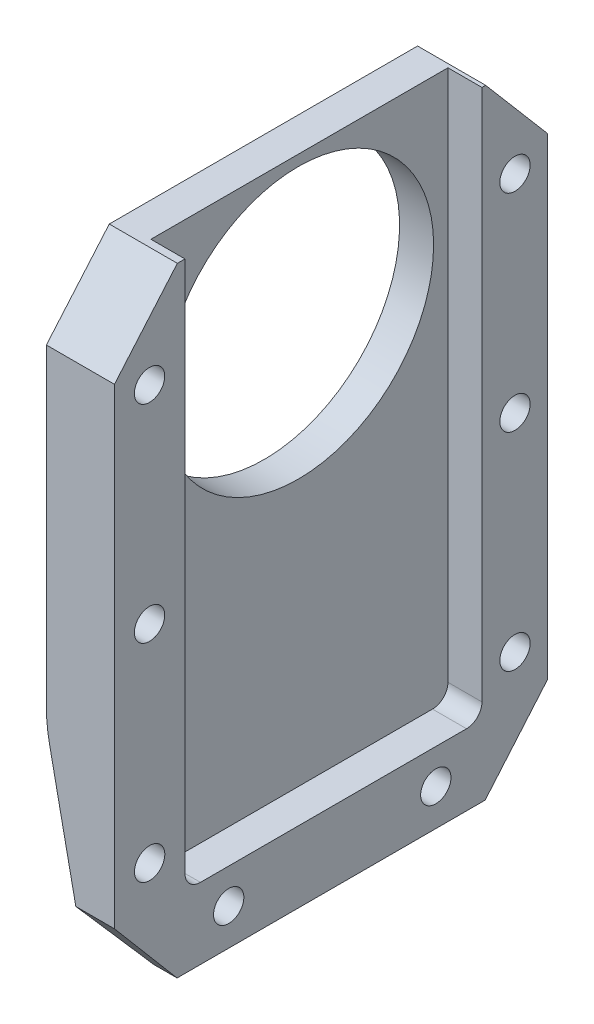
ISO-10303-21;
HEADER;
FILE_DESCRIPTION(('STEP AP214'),'2;1');
FILE_NAME('part.step','',(''),(''),'','','');
FILE_SCHEMA(('AUTOMOTIVE_DESIGN { 1 0 10303 214 1 1 1 1 }'));
ENDSEC;
DATA;
#1=APPLICATION_CONTEXT('core data for automotive mechanical design processes');
#2=APPLICATION_PROTOCOL_DEFINITION('international standard','automotive_design',2000,#1);
#3=PRODUCT_CONTEXT('',#1,'mechanical');
#4=PRODUCT('Part','Part','',(#3));
#5=PRODUCT_RELATED_PRODUCT_CATEGORY('part','',(#4));
#6=PRODUCT_DEFINITION_FORMATION('','',#4);
#7=PRODUCT_DEFINITION_CONTEXT('part definition',#1,'design');
#8=PRODUCT_DEFINITION('design','',#6,#7);
#9=PRODUCT_DEFINITION_SHAPE('','',#8);
#10=(LENGTH_UNIT() NAMED_UNIT(*) SI_UNIT(.MILLI.,.METRE.));
#11=(NAMED_UNIT(*) PLANE_ANGLE_UNIT() SI_UNIT($,.RADIAN.));
#12=(NAMED_UNIT(*) SI_UNIT($,.STERADIAN.) SOLID_ANGLE_UNIT());
#13=UNCERTAINTY_MEASURE_WITH_UNIT(LENGTH_MEASURE(1.E-05),#10,'distance_accuracy_value','');
#14=(GEOMETRIC_REPRESENTATION_CONTEXT(3) GLOBAL_UNCERTAINTY_ASSIGNED_CONTEXT((#13)) GLOBAL_UNIT_ASSIGNED_CONTEXT((#10,
#11,#12)) REPRESENTATION_CONTEXT('',''));
#15=CARTESIAN_POINT('',(0.,0.,0.));
#16=DIRECTION('',(0.,0.,1.));
#17=DIRECTION('',(1.,0.,0.));
#18=AXIS2_PLACEMENT_3D('',#15,#16,#17);
#19=CARTESIAN_POINT('',(-1.91664376205864,0.,35.56));
#20=DIRECTION('',(0.,1.,0.));
#21=DIRECTION('',(0.,0.,1.));
#22=AXIS2_PLACEMENT_3D('',#19,#20,#21);
#23=PLANE('',#22);
#24=DIRECTION('',(0.,0.,-1.));
#25=VECTOR('',#24,1.);
#26=CARTESIAN_POINT('',(-1.91664376205864,0.,35.56));
#27=LINE('',#26,#25);
#28=CARTESIAN_POINT('',(-1.91664376205864,0.,30.4170918583045));
#29=VERTEX_POINT('',#28);
#30=CARTESIAN_POINT('',(-1.91664376205864,0.,5.12869281639009));
#31=VERTEX_POINT('',#30);
#32=EDGE_CURVE('E183',#29,#31,#27,.T.);
#33=ORIENTED_EDGE('',*,*,#32,.T.);
#34=DIRECTION('',(1.,0.,0.));
#35=VECTOR('',#34,1.);
#36=CARTESIAN_POINT('',(-5.588,0.,5.12869281639009));
#37=LINE('',#36,#35);
#38=CARTESIAN_POINT('',(0.,0.,5.12869281639009));
#39=VERTEX_POINT('',#38);
#40=EDGE_CURVE('E242',#31,#39,#37,.T.);
#41=ORIENTED_EDGE('',*,*,#40,.T.);
#42=DIRECTION('',(0.,0.,-1.));
#43=VECTOR('',#42,1.);
#44=CARTESIAN_POINT('',(0.,0.,35.56));
#45=LINE('',#44,#43);
#46=CARTESIAN_POINT('',(0.,0.,30.4170918583045));
#47=VERTEX_POINT('',#46);
#48=EDGE_CURVE('E191',#47,#39,#45,.T.);
#49=ORIENTED_EDGE('',*,*,#48,.F.);
#50=DIRECTION('',(1.,0.,0.));
#51=VECTOR('',#50,1.);
#52=CARTESIAN_POINT('',(-5.588,0.,30.4170918583045));
#53=LINE('',#52,#51);
#54=EDGE_CURVE('E223',#29,#47,#53,.T.);
#55=ORIENTED_EDGE('',*,*,#54,.F.);
#56=EDGE_LOOP('',(#33,#41,#49,#55));
#57=FACE_BOUND('',#56,.T.);
#58=ADVANCED_FACE('F37',(#57),#23,.F.);
#59=CARTESIAN_POINT('',(0.,0.,35.56));
#60=DIRECTION('',(-1.,0.,0.));
#61=DIRECTION('',(0.,0.,1.));
#62=AXIS2_PLACEMENT_3D('',#59,#60,#61);
#63=PLANE('',#62);
#64=CARTESIAN_POINT('',(0.,43.3095233691544,2.67853591924794));
#65=DIRECTION('',(-1.,0.,0.));
#66=DIRECTION('',(0.,0.,1.));
#67=AXIS2_PLACEMENT_3D('',#64,#65,#66);
#68=CIRCLE('',#67,1.24459999999998);
#69=CARTESIAN_POINT('',(0.,43.3095233691544,3.92313591924793));
#70=VERTEX_POINT('',#69);
#71=EDGE_CURVE('E689',#70,#70,#68,.T.);
#72=ORIENTED_EDGE('',*,*,#71,.T.);
#73=EDGE_LOOP('',(#72));
#74=FACE_BOUND('',#73,.T.);
#75=CARTESIAN_POINT('',(0.,26.3095233691544,2.67853591924794));
#76=DIRECTION('',(-1.,0.,0.));
#77=DIRECTION('',(0.,0.,1.));
#78=AXIS2_PLACEMENT_3D('',#75,#76,#77);
#79=CIRCLE('',#78,1.24459999999999);
#80=CARTESIAN_POINT('',(0.,26.3095233691544,3.92313591924793));
#81=VERTEX_POINT('',#80);
#82=EDGE_CURVE('E700',#81,#81,#79,.T.);
#83=ORIENTED_EDGE('',*,*,#82,.T.);
#84=EDGE_LOOP('',(#83));
#85=FACE_BOUND('',#84,.T.);
#86=CARTESIAN_POINT('',(0.,9.30952336915439,2.67853591924794));
#87=DIRECTION('',(-1.,0.,0.));
#88=DIRECTION('',(0.,0.,1.));
#89=AXIS2_PLACEMENT_3D('',#86,#87,#88);
#90=CIRCLE('',#89,1.24459999999999);
#91=CARTESIAN_POINT('',(0.,9.30952336915439,3.92313591924793));
#92=VERTEX_POINT('',#91);
#93=EDGE_CURVE('E703',#92,#92,#90,.T.);
#94=ORIENTED_EDGE('',*,*,#93,.T.);
#95=EDGE_LOOP('',(#94));
#96=FACE_BOUND('',#95,.T.);
#97=CARTESIAN_POINT('',(0.,3.00952336915439,9.17853591924794));
#98=DIRECTION('',(-1.,0.,0.));
#99=DIRECTION('',(0.,0.,1.));
#100=AXIS2_PLACEMENT_3D('',#97,#98,#99);
#101=CIRCLE('',#100,1.24459999999999);
#102=CARTESIAN_POINT('',(0.,3.00952336915439,10.4231359192479));
#103=VERTEX_POINT('',#102);
#104=EDGE_CURVE('E709',#103,#103,#101,.T.);
#105=ORIENTED_EDGE('',*,*,#104,.T.);
#106=EDGE_LOOP('',(#105));
#107=FACE_BOUND('',#106,.T.);
#108=CARTESIAN_POINT('',(0.,2.9991799424324,26.181895158461));
#109=DIRECTION('',(-1.,0.,0.));
#110=DIRECTION('',(0.,0.,1.));
#111=AXIS2_PLACEMENT_3D('',#108,#109,#110);
#112=CIRCLE('',#111,1.24459999999999);
#113=CARTESIAN_POINT('',(0.,2.9991799424324,27.4264951584609));
#114=VERTEX_POINT('',#113);
#115=EDGE_CURVE('E715',#114,#114,#112,.T.);
#116=ORIENTED_EDGE('',*,*,#115,.T.);
#117=EDGE_LOOP('',(#116));
#118=FACE_BOUND('',#117,.T.);
#119=CARTESIAN_POINT('',(0.,9.2991799424324,32.6729429087411));
#120=DIRECTION('',(-1.,0.,0.));
#121=DIRECTION('',(0.,0.,1.));
#122=AXIS2_PLACEMENT_3D('',#119,#120,#121);
#123=CIRCLE('',#122,1.24459999999999);
#124=CARTESIAN_POINT('',(0.,9.2991799424324,33.9175429087411));
#125=VERTEX_POINT('',#124);
#126=EDGE_CURVE('E721',#125,#125,#123,.T.);
#127=ORIENTED_EDGE('',*,*,#126,.T.);
#128=EDGE_LOOP('',(#127));
#129=FACE_BOUND('',#128,.T.);
#130=CARTESIAN_POINT('',(0.,26.3095233691544,32.6785359192479));
#131=DIRECTION('',(-1.,0.,0.));
#132=DIRECTION('',(0.,0.,1.));
#133=AXIS2_PLACEMENT_3D('',#130,#131,#132);
#134=CIRCLE('',#133,1.24459999999999);
#135=CARTESIAN_POINT('',(0.,26.3095233691544,33.9231359192479));
#136=VERTEX_POINT('',#135);
#137=EDGE_CURVE('E730',#136,#136,#134,.T.);
#138=ORIENTED_EDGE('',*,*,#137,.T.);
#139=EDGE_LOOP('',(#138));
#140=FACE_BOUND('',#139,.T.);
#141=CARTESIAN_POINT('',(0.,43.2991799424324,32.6785359192479));
#142=DIRECTION('',(-1.,0.,0.));
#143=DIRECTION('',(0.,0.,1.));
#144=AXIS2_PLACEMENT_3D('',#141,#142,#143);
#145=CIRCLE('',#144,1.24459999999998);
#146=CARTESIAN_POINT('',(0.,43.2991799424324,33.9231359192479));
#147=VERTEX_POINT('',#146);
#148=EDGE_CURVE('E229',#147,#147,#145,.T.);
#149=ORIENTED_EDGE('',*,*,#148,.T.);
#150=EDGE_LOOP('',(#149));
#151=FACE_BOUND('',#150,.T.);
#152=DIRECTION('',(0.,1.,0.));
#153=VECTOR('',#152,1.);
#154=CARTESIAN_POINT('',(0.,0.,0.));
#155=LINE('',#154,#153);
#156=CARTESIAN_POINT('',(0.,6.02953117205409,0.));
#157=VERTEX_POINT('',#156);
#158=CARTESIAN_POINT('',(0.,44.8248953626975,0.));
#159=VERTEX_POINT('',#158);
#160=EDGE_CURVE('E174',#157,#159,#155,.T.);
#161=ORIENTED_EDGE('',*,*,#160,.T.);
#162=DIRECTION('',(0.,-0.761517392748183,-0.648144475053216));
#163=VECTOR('',#162,1.);
#164=CARTESIAN_POINT('',(0.,44.8248953626975,0.));
#165=LINE('',#164,#163);
#166=CARTESIAN_POINT('',(0.,50.8,5.08554511743511));
#167=VERTEX_POINT('',#166);
#168=EDGE_CURVE('E61',#167,#159,#165,.T.);
#169=ORIENTED_EDGE('',*,*,#168,.F.);
#170=DIRECTION('',(0.,0.,-1.));
#171=VECTOR('',#170,1.);
#172=CARTESIAN_POINT('',(0.,50.8,35.56));
#173=LINE('',#172,#171);
#174=CARTESIAN_POINT('',(0.,50.8,5.38804272725211));
#175=VERTEX_POINT('',#174);
#176=EDGE_CURVE('E188',#175,#167,#173,.T.);
#177=ORIENTED_EDGE('',*,*,#176,.F.);
#178=DIRECTION('',(0.,1.,0.));
#179=VECTOR('',#178,1.);
#180=CARTESIAN_POINT('',(0.,50.8,5.38804272725211));
#181=LINE('',#180,#179);
#182=CARTESIAN_POINT('',(0.,7.11199999999999,5.3880427272521));
#183=VERTEX_POINT('',#182);
#184=EDGE_CURVE('E267',#183,#175,#181,.T.);
#185=ORIENTED_EDGE('',*,*,#184,.F.);
#186=CARTESIAN_POINT('',(0.,7.11199999999999,6.6580427272521));
#187=DIRECTION('',(-1.,0.,0.));
#188=DIRECTION('',(0.,0.,1.));
#189=AXIS2_PLACEMENT_3D('',#186,#187,#188);
#190=CIRCLE('',#189,1.27);
#191=CARTESIAN_POINT('',(0.,5.84199999999999,6.6580427272521));
#192=VERTEX_POINT('',#191);
#193=EDGE_CURVE('E218',#183,#192,#190,.T.);
#194=ORIENTED_EDGE('',*,*,#193,.T.);
#195=DIRECTION('',(0.,0.,-1.));
#196=VECTOR('',#195,1.);
#197=CARTESIAN_POINT('',(0.,5.84199999999999,29.7720427272521));
#198=LINE('',#197,#196);
#199=CARTESIAN_POINT('',(0.,5.84199999999999,28.5020427272521));
#200=VERTEX_POINT('',#199);
#201=EDGE_CURVE('E278',#200,#192,#198,.T.);
#202=ORIENTED_EDGE('',*,*,#201,.F.);
#203=CARTESIAN_POINT('',(0.,7.11199999999999,28.5020427272521));
#204=DIRECTION('',(-1.,0.,0.));
#205=DIRECTION('',(0.,0.,1.));
#206=AXIS2_PLACEMENT_3D('',#203,#204,#205);
#207=CIRCLE('',#206,1.27);
#208=CARTESIAN_POINT('',(0.,7.11199999999999,29.7720427272521));
#209=VERTEX_POINT('',#208);
#210=EDGE_CURVE('E216',#200,#209,#207,.T.);
#211=ORIENTED_EDGE('',*,*,#210,.T.);
#212=DIRECTION('',(0.,-1.,0.));
#213=VECTOR('',#212,1.);
#214=CARTESIAN_POINT('',(0.,50.8,29.7720427272521));
#215=LINE('',#214,#213);
#216=CARTESIAN_POINT('',(0.,50.8,29.7720427272521));
#217=VERTEX_POINT('',#216);
#218=EDGE_CURVE('E260',#217,#209,#215,.T.);
#219=ORIENTED_EDGE('',*,*,#218,.F.);
#220=CARTESIAN_POINT('',(0.,50.8,30.3975808510955));
#221=VERTEX_POINT('',#220);
#222=EDGE_CURVE('E189',#221,#217,#173,.T.);
#223=ORIENTED_EDGE('',*,*,#222,.F.);
#224=DIRECTION('',(0.,0.759083371781677,-0.650993421383473));
#225=VECTOR('',#224,1.);
#226=CARTESIAN_POINT('',(0.,44.780420684171,35.56));
#227=LINE('',#226,#225);
#228=CARTESIAN_POINT('',(0.,44.780420684171,35.56));
#229=VERTEX_POINT('',#228);
#230=EDGE_CURVE('E252',#229,#221,#227,.T.);
#231=ORIENTED_EDGE('',*,*,#230,.F.);
#232=DIRECTION('',(0.,1.,0.));
#233=VECTOR('',#232,1.);
#234=CARTESIAN_POINT('',(0.,0.,35.56));
#235=LINE('',#234,#233);
#236=CARTESIAN_POINT('',(0.,6.07121687996455,35.56));
#237=VERTEX_POINT('',#236);
#238=EDGE_CURVE('E177',#237,#229,#235,.T.);
#239=ORIENTED_EDGE('',*,*,#238,.F.);
#240=DIRECTION('',(0.,0.763031396083279,0.646361422573472));
#241=VECTOR('',#240,1.);
#242=CARTESIAN_POINT('',(0.,0.,30.4170918583045));
#243=LINE('',#242,#241);
#244=EDGE_CURVE('E53',#47,#237,#243,.T.);
#245=ORIENTED_EDGE('',*,*,#244,.F.);
#246=ORIENTED_EDGE('',*,*,#48,.T.);
#247=DIRECTION('',(0.,-0.761715388262673,0.647911774305611));
#248=VECTOR('',#247,1.);
#249=CARTESIAN_POINT('',(0.,6.02953117205409,0.));
#250=LINE('',#249,#248);
#251=EDGE_CURVE('E239',#157,#39,#250,.T.);
#252=ORIENTED_EDGE('',*,*,#251,.F.);
#253=EDGE_LOOP('',(#161,#169,#177,#185,#194,#202,#211,#219,#223,#231,#239,#245,#246,#252));
#254=FACE_BOUND('',#253,.T.);
#255=ADVANCED_FACE('F307',(#74,#85,#96,#107,#118,#129,#140,#151,#254),#63,.F.);
#256=CARTESIAN_POINT('',(0.,50.8,35.56));
#257=DIRECTION('',(0.,-1.,0.));
#258=DIRECTION('',(0.,0.,-1.));
#259=AXIS2_PLACEMENT_3D('',#256,#257,#258);
#260=PLANE('',#259);
#261=ORIENTED_EDGE('',*,*,#176,.T.);
#262=DIRECTION('',(1.,0.,0.));
#263=VECTOR('',#262,1.);
#264=CARTESIAN_POINT('',(-5.588,50.8,5.08554511743511));
#265=LINE('',#264,#263);
#266=CARTESIAN_POINT('',(-5.588,50.8,5.08554511743511));
#267=VERTEX_POINT('',#266);
#268=EDGE_CURVE('E157',#267,#167,#265,.T.);
#269=ORIENTED_EDGE('',*,*,#268,.F.);
#270=DIRECTION('',(0.,0.,-1.));
#271=VECTOR('',#270,1.);
#272=CARTESIAN_POINT('',(-5.588,50.8,35.56));
#273=LINE('',#272,#271);
#274=CARTESIAN_POINT('',(-5.588,50.8,30.3975808510955));
#275=VERTEX_POINT('',#274);
#276=EDGE_CURVE('E167',#275,#267,#273,.T.);
#277=ORIENTED_EDGE('',*,*,#276,.F.);
#278=DIRECTION('',(1.,0.,0.));
#279=VECTOR('',#278,1.);
#280=CARTESIAN_POINT('',(-5.588,50.8,30.3975808510955));
#281=LINE('',#280,#279);
#282=EDGE_CURVE('E257',#275,#221,#281,.T.);
#283=ORIENTED_EDGE('',*,*,#282,.T.);
#284=ORIENTED_EDGE('',*,*,#222,.T.);
#285=DIRECTION('',(1.,0.,0.));
#286=VECTOR('',#285,1.);
#287=CARTESIAN_POINT('',(-2.794,50.8,29.7720427272521));
#288=LINE('',#287,#286);
#289=CARTESIAN_POINT('',(-2.794,50.8,29.7720427272521));
#290=VERTEX_POINT('',#289);
#291=EDGE_CURVE('E179',#290,#217,#288,.T.);
#292=ORIENTED_EDGE('',*,*,#291,.F.);
#293=DIRECTION('',(0.,0.,1.));
#294=VECTOR('',#293,1.);
#295=CARTESIAN_POINT('',(-2.794,50.8,29.7720427272521));
#296=LINE('',#295,#294);
#297=CARTESIAN_POINT('',(-2.794,50.8,5.3880427272521));
#298=VERTEX_POINT('',#297);
#299=EDGE_CURVE('E272',#298,#290,#296,.T.);
#300=ORIENTED_EDGE('',*,*,#299,.F.);
#301=DIRECTION('',(1.,0.,0.));
#302=VECTOR('',#301,1.);
#303=CARTESIAN_POINT('',(-2.794,50.8,5.38804272725211));
#304=LINE('',#303,#302);
#305=EDGE_CURVE('E275',#298,#175,#304,.T.);
#306=ORIENTED_EDGE('',*,*,#305,.T.);
#307=EDGE_LOOP('',(#261,#269,#277,#283,#284,#292,#300,#306));
#308=FACE_BOUND('',#307,.T.);
#309=ADVANCED_FACE('F312',(#308),#260,.F.);
#310=CARTESIAN_POINT('',(-5.588,50.8,35.56));
#311=DIRECTION('',(1.,0.,0.));
#312=DIRECTION('',(0.,0.,-1.));
#313=AXIS2_PLACEMENT_3D('',#310,#311,#312);
#314=PLANE('',#313);
#315=CARTESIAN_POINT('',(-5.588,43.3095233691544,2.67853591924794));
#316=DIRECTION('',(-1.,0.,0.));
#317=DIRECTION('',(0.,0.,1.));
#318=AXIS2_PLACEMENT_3D('',#315,#316,#317);
#319=CIRCLE('',#318,1.8796);
#320=CARTESIAN_POINT('',(-5.588,43.3095233691544,4.55813591924795));
#321=VERTEX_POINT('',#320);
#322=EDGE_CURVE('E687',#321,#321,#319,.T.);
#323=ORIENTED_EDGE('',*,*,#322,.F.);
#324=EDGE_LOOP('',(#323));
#325=FACE_BOUND('',#324,.T.);
#326=CARTESIAN_POINT('',(-5.588,26.3095233691544,2.67853591924794));
#327=DIRECTION('',(-1.,0.,0.));
#328=DIRECTION('',(0.,0.,1.));
#329=AXIS2_PLACEMENT_3D('',#326,#327,#328);
#330=CIRCLE('',#329,1.8796);
#331=CARTESIAN_POINT('',(-5.588,26.3095233691544,4.55813591924794));
#332=VERTEX_POINT('',#331);
#333=EDGE_CURVE('E694',#332,#332,#330,.T.);
#334=ORIENTED_EDGE('',*,*,#333,.F.);
#335=EDGE_LOOP('',(#334));
#336=FACE_BOUND('',#335,.T.);
#337=CARTESIAN_POINT('',(-5.588,26.3095233691544,32.6785359192479));
#338=DIRECTION('',(-1.,0.,0.));
#339=DIRECTION('',(0.,0.,1.));
#340=AXIS2_PLACEMENT_3D('',#337,#338,#339);
#341=CIRCLE('',#340,1.8796);
#342=CARTESIAN_POINT('',(-5.588,26.3095233691544,34.5581359192479));
#343=VERTEX_POINT('',#342);
#344=EDGE_CURVE('E724',#343,#343,#341,.T.);
#345=ORIENTED_EDGE('',*,*,#344,.F.);
#346=EDGE_LOOP('',(#345));
#347=FACE_BOUND('',#346,.T.);
#348=CARTESIAN_POINT('',(-5.588,43.2991799424324,32.6785359192479));
#349=DIRECTION('',(-1.,0.,0.));
#350=DIRECTION('',(0.,0.,1.));
#351=AXIS2_PLACEMENT_3D('',#348,#349,#350);
#352=CIRCLE('',#351,1.8796);
#353=CARTESIAN_POINT('',(-5.588,43.2991799424324,34.558135919248));
#354=VERTEX_POINT('',#353);
#355=EDGE_CURVE('E733',#354,#354,#352,.T.);
#356=ORIENTED_EDGE('',*,*,#355,.F.);
#357=EDGE_LOOP('',(#356));
#358=FACE_BOUND('',#357,.T.);
#359=CARTESIAN_POINT('',(-5.588,38.8095233691544,17.6785359192479));
#360=DIRECTION('',(-1.,0.,0.));
#361=DIRECTION('',(0.,0.,1.));
#362=AXIS2_PLACEMENT_3D('',#359,#360,#361);
#363=CIRCLE('',#362,11.1125);
#364=CARTESIAN_POINT('',(-5.588,38.8095233691544,28.7910359192479));
#365=VERTEX_POINT('',#364);
#366=EDGE_CURVE('E224',#365,#365,#363,.T.);
#367=ORIENTED_EDGE('',*,*,#366,.F.);
#368=EDGE_LOOP('',(#367));
#369=FACE_BOUND('',#368,.T.);
#370=ORIENTED_EDGE('',*,*,#276,.T.);
#371=DIRECTION('',(0.,-0.761517392748183,-0.648144475053216));
#372=VECTOR('',#371,1.);
#373=CARTESIAN_POINT('',(-5.588,44.8248953626975,0.));
#374=LINE('',#373,#372);
#375=CARTESIAN_POINT('',(-5.588,44.8248953626975,0.));
#376=VERTEX_POINT('',#375);
#377=EDGE_CURVE('E151',#267,#376,#374,.T.);
#378=ORIENTED_EDGE('',*,*,#377,.T.);
#379=DIRECTION('',(0.,-1.,0.));
#380=VECTOR('',#379,1.);
#381=CARTESIAN_POINT('',(-5.588,50.8,0.));
#382=LINE('',#381,#380);
#383=CARTESIAN_POINT('',(-5.588,19.0775124180395,0.));
#384=VERTEX_POINT('',#383);
#385=EDGE_CURVE('E163',#376,#384,#382,.T.);
#386=ORIENTED_EDGE('',*,*,#385,.T.);
#387=DIRECTION('',(0.,0.,-1.));
#388=VECTOR('',#387,1.);
#389=CARTESIAN_POINT('',(-5.588,19.0775124180395,35.56));
#390=LINE('',#389,#388);
#391=CARTESIAN_POINT('',(-5.588,19.0775124180395,35.56));
#392=VERTEX_POINT('',#391);
#393=EDGE_CURVE('E198',#384,#392,#390,.F.);
#394=ORIENTED_EDGE('',*,*,#393,.T.);
#395=DIRECTION('',(0.,-1.,0.));
#396=VECTOR('',#395,1.);
#397=CARTESIAN_POINT('',(-5.588,50.8,35.56));
#398=LINE('',#397,#396);
#399=CARTESIAN_POINT('',(-5.588,44.780420684171,35.56));
#400=VERTEX_POINT('',#399);
#401=EDGE_CURVE('E287',#400,#392,#398,.T.);
#402=ORIENTED_EDGE('',*,*,#401,.F.);
#403=DIRECTION('',(0.,0.759083371781677,-0.650993421383473));
#404=VECTOR('',#403,1.);
#405=CARTESIAN_POINT('',(-5.588,44.780420684171,35.56));
#406=LINE('',#405,#404);
#407=EDGE_CURVE('E253',#400,#275,#406,.T.);
#408=ORIENTED_EDGE('',*,*,#407,.T.);
#409=EDGE_LOOP('',(#370,#378,#386,#394,#402,#408));
#410=FACE_BOUND('',#409,.T.);
#411=ADVANCED_FACE('F161',(#325,#336,#347,#358,#369,#410),#314,.F.);
#412=CARTESIAN_POINT('',(-5.588,17.78,35.56));
#413=DIRECTION('',(0.979339732195538,0.20222188047581,0.));
#414=DIRECTION('',(-0.20222188047581,0.979339732195538,0.));
#415=AXIS2_PLACEMENT_3D('',#412,#413,#414);
#416=PLANE('',#415);
#417=CARTESIAN_POINT('',(-3.8389484129926,9.30952336915439,2.67853591924794));
#418=DIRECTION('',(0.979339732195538,0.20222188047581,0.));
#419=DIRECTION('',(-0.20222188047581,0.979339732195538,0.));
#420=AXIS2_PLACEMENT_3D('',#417,#418,#419);
#421=ELLIPSE('',#420,1.27085623005387,1.24459999999999);
#422=CARTESIAN_POINT('',(-4.0959433496485,10.5541233691544,2.67853591924794));
#423=VERTEX_POINT('',#422);
#424=EDGE_CURVE('E706',#423,#423,#421,.T.);
#425=ORIENTED_EDGE('',*,*,#424,.T.);
#426=EDGE_LOOP('',(#425));
#427=FACE_BOUND('',#426,.T.);
#428=CARTESIAN_POINT('',(-2.53807415545433,3.00952336915439,9.17853591924794));
#429=DIRECTION('',(0.979339732195538,0.20222188047581,0.));
#430=DIRECTION('',(-0.20222188047581,0.979339732195538,0.));
#431=AXIS2_PLACEMENT_3D('',#428,#429,#430);
#432=ELLIPSE('',#431,1.27085623005388,1.24459999999999);
#433=CARTESIAN_POINT('',(-2.79506909211022,4.25412336915439,9.17853591924794));
#434=VERTEX_POINT('',#433);
#435=EDGE_CURVE('E712',#434,#434,#432,.T.);
#436=ORIENTED_EDGE('',*,*,#435,.T.);
#437=EDGE_LOOP('',(#436));
#438=FACE_BOUND('',#437,.T.);
#439=CARTESIAN_POINT('',(-2.53593836219125,2.9991799424324,26.181895158461));
#440=DIRECTION('',(0.979339732195538,0.20222188047581,0.));
#441=DIRECTION('',(-0.20222188047581,0.979339732195538,0.));
#442=AXIS2_PLACEMENT_3D('',#439,#440,#441);
#443=ELLIPSE('',#442,1.27085623005388,1.24459999999999);
#444=CARTESIAN_POINT('',(-2.79293329884715,4.24377994243239,26.181895158461));
#445=VERTEX_POINT('',#444);
#446=EDGE_CURVE('E718',#445,#445,#443,.T.);
#447=ORIENTED_EDGE('',*,*,#446,.T.);
#448=EDGE_LOOP('',(#447));
#449=FACE_BOUND('',#448,.T.);
#450=CARTESIAN_POINT('',(-3.83681261972953,9.2991799424324,32.6729429087411));
#451=DIRECTION('',(0.979339732195538,0.20222188047581,0.));
#452=DIRECTION('',(-0.20222188047581,0.979339732195538,0.));
#453=AXIS2_PLACEMENT_3D('',#450,#451,#452);
#454=ELLIPSE('',#453,1.27085623005387,1.24459999999999);
#455=CARTESIAN_POINT('',(-4.09380755638542,10.5437799424324,32.6729429087411));
#456=VERTEX_POINT('',#455);
#457=EDGE_CURVE('E41',#456,#456,#454,.T.);
#458=ORIENTED_EDGE('',*,*,#457,.T.);
#459=EDGE_LOOP('',(#458));
#460=FACE_BOUND('',#459,.T.);
#461=DIRECTION('',(0.20222188047581,-0.979339732195537,0.));
#462=VECTOR('',#461,1.);
#463=CARTESIAN_POINT('',(-5.588,17.78,0.));
#464=LINE('',#463,#462);
#465=CARTESIAN_POINT('',(-5.32561459888333,16.5092945359968,0.));
#466=VERTEX_POINT('',#465);
#467=CARTESIAN_POINT('',(-3.16166945836813,6.02953117205409,0.));
#468=VERTEX_POINT('',#467);
#469=EDGE_CURVE('E173',#466,#468,#464,.T.);
#470=ORIENTED_EDGE('',*,*,#469,.T.);
#471=DIRECTION('',(0.155374932595926,-0.752464790260893,0.640043256146366));
#472=VECTOR('',#471,1.);
#473=CARTESIAN_POINT('',(-1.05771680292443,-4.15969476772149,8.666910973793));
#474=LINE('',#473,#472);
#475=EDGE_CURVE('E240',#468,#31,#474,.T.);
#476=ORIENTED_EDGE('',*,*,#475,.T.);
#477=ORIENTED_EDGE('',*,*,#32,.F.);
#478=DIRECTION('',(-0.155636875365988,0.753733352108303,0.638485079658008));
#479=VECTOR('',#478,1.);
#480=CARTESIAN_POINT('',(-4.60238333527081,13.0067600409402,41.4350761329861));
#481=LINE('',#480,#479);
#482=CARTESIAN_POINT('',(-3.1702770558805,6.07121687996455,35.56));
#483=VERTEX_POINT('',#482);
#484=EDGE_CURVE('E249',#29,#483,#481,.T.);
#485=ORIENTED_EDGE('',*,*,#484,.T.);
#486=DIRECTION('',(0.20222188047581,-0.979339732195537,0.));
#487=VECTOR('',#486,1.);
#488=CARTESIAN_POINT('',(-5.588,17.78,35.56));
#489=LINE('',#488,#487);
#490=CARTESIAN_POINT('',(-5.32561459888333,16.5092945359968,35.56));
#491=VERTEX_POINT('',#490);
#492=EDGE_CURVE('E186',#491,#483,#489,.T.);
#493=ORIENTED_EDGE('',*,*,#492,.F.);
#494=DIRECTION('',(0.,0.,-1.));
#495=VECTOR('',#494,1.);
#496=CARTESIAN_POINT('',(-5.32561459888333,16.5092945359968,35.56));
#497=LINE('',#496,#495);
#498=EDGE_CURVE('E194',#491,#466,#497,.T.);
#499=ORIENTED_EDGE('',*,*,#498,.T.);
#500=EDGE_LOOP('',(#470,#476,#477,#485,#493,#499));
#501=FACE_BOUND('',#500,.T.);
#502=ADVANCED_FACE('F296',(#427,#438,#449,#460,#501),#416,.F.);
#503=CARTESIAN_POINT('',(0.,0.,35.56));
#504=DIRECTION('',(0.,0.,1.));
#505=DIRECTION('',(1.,0.,0.));
#506=AXIS2_PLACEMENT_3D('',#503,#504,#505);
#507=PLANE('',#506);
#508=DIRECTION('',(-1.,0.,0.));
#509=VECTOR('',#508,1.);
#510=CARTESIAN_POINT('',(0.,6.07121687996455,35.56));
#511=LINE('',#510,#509);
#512=EDGE_CURVE('E11',#237,#483,#511,.T.);
#513=ORIENTED_EDGE('',*,*,#512,.F.);
#514=ORIENTED_EDGE('',*,*,#238,.T.);
#515=DIRECTION('',(1.,0.,0.));
#516=VECTOR('',#515,1.);
#517=CARTESIAN_POINT('',(-5.588,44.780420684171,35.56));
#518=LINE('',#517,#516);
#519=EDGE_CURVE('E255',#400,#229,#518,.T.);
#520=ORIENTED_EDGE('',*,*,#519,.F.);
#521=ORIENTED_EDGE('',*,*,#401,.T.);
#522=CARTESIAN_POINT('',(7.112,19.0775124180395,35.56));
#523=DIRECTION('',(0.,0.,1.));
#524=DIRECTION('',(1.,0.,0.));
#525=AXIS2_PLACEMENT_3D('',#522,#523,#524);
#526=CIRCLE('',#525,12.7);
#527=EDGE_CURVE('E200',#392,#491,#526,.T.);
#528=ORIENTED_EDGE('',*,*,#527,.T.);
#529=ORIENTED_EDGE('',*,*,#492,.T.);
#530=EDGE_LOOP('',(#513,#514,#520,#521,#528,#529));
#531=FACE_BOUND('',#530,.T.);
#532=ADVANCED_FACE('F291',(#531),#507,.T.);
#533=CARTESIAN_POINT('',(0.,0.,0.));
#534=DIRECTION('',(0.,0.,1.));
#535=DIRECTION('',(1.,0.,0.));
#536=AXIS2_PLACEMENT_3D('',#533,#534,#535);
#537=PLANE('',#536);
#538=ORIENTED_EDGE('',*,*,#385,.F.);
#539=DIRECTION('',(1.,0.,0.));
#540=VECTOR('',#539,1.);
#541=CARTESIAN_POINT('',(-5.588,44.8248953626975,0.));
#542=LINE('',#541,#540);
#543=EDGE_CURVE('E148',#376,#159,#542,.T.);
#544=ORIENTED_EDGE('',*,*,#543,.T.);
#545=ORIENTED_EDGE('',*,*,#160,.F.);
#546=DIRECTION('',(-1.,0.,0.));
#547=VECTOR('',#546,1.);
#548=CARTESIAN_POINT('',(0.,6.02953117205409,0.));
#549=LINE('',#548,#547);
#550=EDGE_CURVE('E46',#157,#468,#549,.T.);
#551=ORIENTED_EDGE('',*,*,#550,.T.);
#552=ORIENTED_EDGE('',*,*,#469,.F.);
#553=CARTESIAN_POINT('',(7.112,19.0775124180395,0.));
#554=DIRECTION('',(0.,0.,1.));
#555=DIRECTION('',(1.,0.,0.));
#556=AXIS2_PLACEMENT_3D('',#553,#554,#555);
#557=CIRCLE('',#556,12.7);
#558=EDGE_CURVE('E171',#466,#384,#557,.F.);
#559=ORIENTED_EDGE('',*,*,#558,.T.);
#560=EDGE_LOOP('',(#538,#544,#545,#551,#552,#559));
#561=FACE_BOUND('',#560,.T.);
#562=ADVANCED_FACE('F169',(#561),#537,.F.);
#563=CARTESIAN_POINT('',(7.112,19.0775124180395,35.56));
#564=DIRECTION('',(0.,0.,-1.));
#565=DIRECTION('',(-1.,0.,0.));
#566=AXIS2_PLACEMENT_3D('',#563,#564,#565);
#567=CYLINDRICAL_SURFACE('',#566,12.7);
#568=ORIENTED_EDGE('',*,*,#527,.F.);
#569=ORIENTED_EDGE('',*,*,#393,.F.);
#570=ORIENTED_EDGE('',*,*,#558,.F.);
#571=ORIENTED_EDGE('',*,*,#498,.F.);
#572=EDGE_LOOP('',(#568,#569,#570,#571));
#573=FACE_BOUND('',#572,.T.);
#574=ADVANCED_FACE('F299',(#573),#567,.T.);
#575=CARTESIAN_POINT('',(-2.794,50.8,29.7720427272521));
#576=DIRECTION('',(0.,0.,1.));
#577=DIRECTION('',(0.,-1.,0.));
#578=AXIS2_PLACEMENT_3D('',#575,#576,#577);
#579=PLANE('',#578);
#580=ORIENTED_EDGE('',*,*,#218,.T.);
#581=DIRECTION('',(1.,0.,0.));
#582=VECTOR('',#581,1.);
#583=CARTESIAN_POINT('',(-2.794,7.11199999999999,29.7720427272521));
#584=LINE('',#583,#582);
#585=CARTESIAN_POINT('',(-2.794,7.11199999999999,29.7720427272521));
#586=VERTEX_POINT('',#585);
#587=EDGE_CURVE('E207',#209,#586,#584,.F.);
#588=ORIENTED_EDGE('',*,*,#587,.T.);
#589=DIRECTION('',(0.,-1.,0.));
#590=VECTOR('',#589,1.);
#591=CARTESIAN_POINT('',(-2.794,50.8,29.7720427272521));
#592=LINE('',#591,#590);
#593=EDGE_CURVE('E263',#290,#586,#592,.T.);
#594=ORIENTED_EDGE('',*,*,#593,.F.);
#595=ORIENTED_EDGE('',*,*,#291,.T.);
#596=EDGE_LOOP('',(#580,#588,#594,#595));
#597=FACE_BOUND('',#596,.T.);
#598=ADVANCED_FACE('F315',(#597),#579,.F.);
#599=CARTESIAN_POINT('',(-2.794,50.8,5.38804272725211));
#600=DIRECTION('',(0.,0.,-1.));
#601=DIRECTION('',(0.,1.,0.));
#602=AXIS2_PLACEMENT_3D('',#599,#600,#601);
#603=PLANE('',#602);
#604=DIRECTION('',(0.,1.,0.));
#605=VECTOR('',#604,1.);
#606=CARTESIAN_POINT('',(-2.794,50.8,5.38804272725211));
#607=LINE('',#606,#605);
#608=CARTESIAN_POINT('',(-2.794,7.11199999999999,5.3880427272521));
#609=VERTEX_POINT('',#608);
#610=EDGE_CURVE('E270',#609,#298,#607,.T.);
#611=ORIENTED_EDGE('',*,*,#610,.F.);
#612=DIRECTION('',(1.,0.,0.));
#613=VECTOR('',#612,1.);
#614=CARTESIAN_POINT('',(0.,7.11199999999999,5.3880427272521));
#615=LINE('',#614,#613);
#616=EDGE_CURVE('E213',#609,#183,#615,.T.);
#617=ORIENTED_EDGE('',*,*,#616,.T.);
#618=ORIENTED_EDGE('',*,*,#184,.T.);
#619=ORIENTED_EDGE('',*,*,#305,.F.);
#620=EDGE_LOOP('',(#611,#617,#618,#619));
#621=FACE_BOUND('',#620,.T.);
#622=ADVANCED_FACE('F372',(#621),#603,.F.);
#623=CARTESIAN_POINT('',(-2.794,5.84199999999999,29.7720427272521));
#624=DIRECTION('',(0.,-1.,0.));
#625=DIRECTION('',(0.,0.,-1.));
#626=AXIS2_PLACEMENT_3D('',#623,#624,#625);
#627=PLANE('',#626);
#628=DIRECTION('',(0.,0.,-1.));
#629=VECTOR('',#628,1.);
#630=CARTESIAN_POINT('',(-2.794,5.84199999999999,29.7720427272521));
#631=LINE('',#630,#629);
#632=CARTESIAN_POINT('',(-2.794,5.84199999999999,28.5020427272521));
#633=VERTEX_POINT('',#632);
#634=CARTESIAN_POINT('',(-2.794,5.84199999999999,6.6580427272521));
#635=VERTEX_POINT('',#634);
#636=EDGE_CURVE('E266',#633,#635,#631,.T.);
#637=ORIENTED_EDGE('',*,*,#636,.F.);
#638=DIRECTION('',(1.,0.,0.));
#639=VECTOR('',#638,1.);
#640=CARTESIAN_POINT('',(0.,5.84199999999999,28.5020427272521));
#641=LINE('',#640,#639);
#642=EDGE_CURVE('E204',#633,#200,#641,.T.);
#643=ORIENTED_EDGE('',*,*,#642,.T.);
#644=ORIENTED_EDGE('',*,*,#201,.T.);
#645=DIRECTION('',(1.,0.,0.));
#646=VECTOR('',#645,1.);
#647=CARTESIAN_POINT('',(-2.794,5.84199999999999,6.6580427272521));
#648=LINE('',#647,#646);
#649=EDGE_CURVE('E202',#192,#635,#648,.F.);
#650=ORIENTED_EDGE('',*,*,#649,.T.);
#651=EDGE_LOOP('',(#637,#643,#644,#650));
#652=FACE_BOUND('',#651,.T.);
#653=ADVANCED_FACE('F362',(#652),#627,.F.);
#654=CARTESIAN_POINT('',(-2.794,0.,0.));
#655=DIRECTION('',(1.,0.,0.));
#656=DIRECTION('',(0.,0.,-1.));
#657=AXIS2_PLACEMENT_3D('',#654,#655,#656);
#658=PLANE('',#657);
#659=CARTESIAN_POINT('',(-2.794,38.8095233691544,17.6785359192479));
#660=DIRECTION('',(1.,0.,0.));
#661=DIRECTION('',(0.,0.,-1.));
#662=AXIS2_PLACEMENT_3D('',#659,#660,#661);
#663=CIRCLE('',#662,11.1125);
#664=CARTESIAN_POINT('',(-2.794,38.8095233691544,6.56603591924795));
#665=VERTEX_POINT('',#664);
#666=EDGE_CURVE('E221',#665,#665,#663,.T.);
#667=ORIENTED_EDGE('',*,*,#666,.F.);
#668=EDGE_LOOP('',(#667));
#669=FACE_BOUND('',#668,.T.);
#670=ORIENTED_EDGE('',*,*,#593,.T.);
#671=CARTESIAN_POINT('',(-2.794,7.11199999999999,28.5020427272521));
#672=DIRECTION('',(1.,0.,0.));
#673=DIRECTION('',(0.,0.,-1.));
#674=AXIS2_PLACEMENT_3D('',#671,#672,#673);
#675=CIRCLE('',#674,1.27);
#676=EDGE_CURVE('E211',#586,#633,#675,.T.);
#677=ORIENTED_EDGE('',*,*,#676,.T.);
#678=ORIENTED_EDGE('',*,*,#636,.T.);
#679=CARTESIAN_POINT('',(-2.794,7.11199999999999,6.6580427272521));
#680=DIRECTION('',(1.,0.,0.));
#681=DIRECTION('',(0.,0.,-1.));
#682=AXIS2_PLACEMENT_3D('',#679,#680,#681);
#683=CIRCLE('',#682,1.27);
#684=EDGE_CURVE('E209',#635,#609,#683,.T.);
#685=ORIENTED_EDGE('',*,*,#684,.T.);
#686=ORIENTED_EDGE('',*,*,#610,.T.);
#687=ORIENTED_EDGE('',*,*,#299,.T.);
#688=EDGE_LOOP('',(#670,#677,#678,#685,#686,#687));
#689=FACE_BOUND('',#688,.T.);
#690=ADVANCED_FACE('F319',(#669,#689),#658,.T.);
#691=CARTESIAN_POINT('',(-2.794,7.11199999999999,28.5020427272521));
#692=DIRECTION('',(-1.,0.,0.));
#693=DIRECTION('',(0.,0.,1.));
#694=AXIS2_PLACEMENT_3D('',#691,#692,#693);
#695=CYLINDRICAL_SURFACE('',#694,1.27);
#696=ORIENTED_EDGE('',*,*,#676,.F.);
#697=ORIENTED_EDGE('',*,*,#587,.F.);
#698=ORIENTED_EDGE('',*,*,#210,.F.);
#699=ORIENTED_EDGE('',*,*,#642,.F.);
#700=EDGE_LOOP('',(#696,#697,#698,#699));
#701=FACE_BOUND('',#700,.T.);
#702=ADVANCED_FACE('F354',(#701),#695,.F.);
#703=CARTESIAN_POINT('',(-2.794,7.11199999999999,6.6580427272521));
#704=DIRECTION('',(-1.,0.,0.));
#705=DIRECTION('',(0.,0.,1.));
#706=AXIS2_PLACEMENT_3D('',#703,#704,#705);
#707=CYLINDRICAL_SURFACE('',#706,1.27);
#708=ORIENTED_EDGE('',*,*,#684,.F.);
#709=ORIENTED_EDGE('',*,*,#649,.F.);
#710=ORIENTED_EDGE('',*,*,#193,.F.);
#711=ORIENTED_EDGE('',*,*,#616,.F.);
#712=EDGE_LOOP('',(#708,#709,#710,#711));
#713=FACE_BOUND('',#712,.T.);
#714=ADVANCED_FACE('F39',(#713),#707,.F.);
#715=CARTESIAN_POINT('',(-5.588,44.780420684171,35.56));
#716=DIRECTION('',(0.,-0.650993421383473,-0.759083371781677));
#717=DIRECTION('',(0.,0.759083371781677,-0.650993421383473));
#718=AXIS2_PLACEMENT_3D('',#715,#716,#717);
#719=PLANE('',#718);
#720=ORIENTED_EDGE('',*,*,#230,.T.);
#721=ORIENTED_EDGE('',*,*,#282,.F.);
#722=ORIENTED_EDGE('',*,*,#407,.F.);
#723=ORIENTED_EDGE('',*,*,#519,.T.);
#724=EDGE_LOOP('',(#720,#721,#722,#723));
#725=FACE_BOUND('',#724,.T.);
#726=ADVANCED_FACE('F304',(#725),#719,.F.);
#727=CARTESIAN_POINT('',(-5.588,6.02953117205409,0.));
#728=DIRECTION('',(0.,0.647911774305611,0.761715388262673));
#729=DIRECTION('',(0.,-0.761715388262673,0.647911774305611));
#730=AXIS2_PLACEMENT_3D('',#727,#728,#729);
#731=PLANE('',#730);
#732=ORIENTED_EDGE('',*,*,#550,.F.);
#733=ORIENTED_EDGE('',*,*,#251,.T.);
#734=ORIENTED_EDGE('',*,*,#40,.F.);
#735=ORIENTED_EDGE('',*,*,#475,.F.);
#736=EDGE_LOOP('',(#732,#733,#734,#735));
#737=FACE_BOUND('',#736,.T.);
#738=ADVANCED_FACE('F340',(#737),#731,.F.);
#739=CARTESIAN_POINT('',(-5.588,44.8248953626975,0.));
#740=DIRECTION('',(0.,-0.648144475053216,0.761517392748183));
#741=DIRECTION('',(0.,-0.761517392748183,-0.648144475053216));
#742=AXIS2_PLACEMENT_3D('',#739,#740,#741);
#743=PLANE('',#742);
#744=ORIENTED_EDGE('',*,*,#168,.T.);
#745=ORIENTED_EDGE('',*,*,#543,.F.);
#746=ORIENTED_EDGE('',*,*,#377,.F.);
#747=ORIENTED_EDGE('',*,*,#268,.T.);
#748=EDGE_LOOP('',(#744,#745,#746,#747));
#749=FACE_BOUND('',#748,.T.);
#750=ADVANCED_FACE('F150',(#749),#743,.F.);
#751=CARTESIAN_POINT('',(-5.588,0.,30.4170918583045));
#752=DIRECTION('',(0.,0.646361422573472,-0.763031396083279));
#753=DIRECTION('',(0.,0.763031396083279,0.646361422573472));
#754=AXIS2_PLACEMENT_3D('',#751,#752,#753);
#755=PLANE('',#754);
#756=ORIENTED_EDGE('',*,*,#54,.T.);
#757=ORIENTED_EDGE('',*,*,#244,.T.);
#758=ORIENTED_EDGE('',*,*,#512,.T.);
#759=ORIENTED_EDGE('',*,*,#484,.F.);
#760=EDGE_LOOP('',(#756,#757,#758,#759));
#761=FACE_BOUND('',#760,.T.);
#762=ADVANCED_FACE('F330',(#761),#755,.F.);
#763=CARTESIAN_POINT('',(-5.588,38.8095233691544,17.6785359192479));
#764=DIRECTION('',(-1.,0.,0.));
#765=DIRECTION('',(0.,0.,1.));
#766=AXIS2_PLACEMENT_3D('',#763,#764,#765);
#767=CYLINDRICAL_SURFACE('',#766,11.1125);
#768=ORIENTED_EDGE('',*,*,#666,.T.);
#769=EDGE_LOOP('',(#768));
#770=FACE_BOUND('',#769,.T.);
#771=ORIENTED_EDGE('',*,*,#366,.T.);
#772=EDGE_LOOP('',(#771));
#773=FACE_BOUND('',#772,.T.);
#774=ADVANCED_FACE('F332',(#770,#773),#767,.F.);
#775=CARTESIAN_POINT('',(-5.588,43.2991799424324,32.6785359192479));
#776=DIRECTION('',(-1.,0.,0.));
#777=DIRECTION('',(0.,0.,1.));
#778=AXIS2_PLACEMENT_3D('',#775,#776,#777);
#779=CYLINDRICAL_SURFACE('',#778,1.24459999999999);
#780=ORIENTED_EDGE('',*,*,#148,.F.);
#781=EDGE_LOOP('',(#780));
#782=FACE_BOUND('',#781,.T.);
#783=CARTESIAN_POINT('',(-4.953,43.2991799424324,32.6785359192479));
#784=DIRECTION('',(-1.,0.,0.));
#785=DIRECTION('',(0.,0.,1.));
#786=AXIS2_PLACEMENT_3D('',#783,#784,#785);
#787=CIRCLE('',#786,1.2446);
#788=CARTESIAN_POINT('',(-4.953,43.2991799424324,33.9231359192479));
#789=VERTEX_POINT('',#788);
#790=EDGE_CURVE('E234',#789,#789,#787,.T.);
#791=ORIENTED_EDGE('',*,*,#790,.T.);
#792=EDGE_LOOP('',(#791));
#793=FACE_BOUND('',#792,.T.);
#794=ADVANCED_FACE('F338',(#782,#793),#779,.F.);
#795=CARTESIAN_POINT('',(-5.588,43.2991799424324,32.6785359192479));
#796=DIRECTION('',(-1.,0.,0.));
#797=DIRECTION('',(0.,0.,1.));
#798=AXIS2_PLACEMENT_3D('',#795,#796,#797);
#799=CONICAL_SURFACE('',#798,1.8796,0.78539816339745);
#800=ORIENTED_EDGE('',*,*,#790,.F.);
#801=EDGE_LOOP('',(#800));
#802=FACE_BOUND('',#801,.T.);
#803=ORIENTED_EDGE('',*,*,#355,.T.);
#804=EDGE_LOOP('',(#803));
#805=FACE_BOUND('',#804,.T.);
#806=ADVANCED_FACE('F535',(#802,#805),#799,.F.);
#807=CARTESIAN_POINT('',(-5.588,26.3095233691544,32.6785359192479));
#808=DIRECTION('',(-1.,0.,0.));
#809=DIRECTION('',(0.,0.,1.));
#810=AXIS2_PLACEMENT_3D('',#807,#808,#809);
#811=CYLINDRICAL_SURFACE('',#810,1.24459999999999);
#812=ORIENTED_EDGE('',*,*,#137,.F.);
#813=EDGE_LOOP('',(#812));
#814=FACE_BOUND('',#813,.T.);
#815=CARTESIAN_POINT('',(-4.953,26.3095233691544,32.6785359192479));
#816=DIRECTION('',(-1.,0.,0.));
#817=DIRECTION('',(0.,0.,1.));
#818=AXIS2_PLACEMENT_3D('',#815,#816,#817);
#819=CIRCLE('',#818,1.2446);
#820=CARTESIAN_POINT('',(-4.953,26.3095233691544,33.9231359192479));
#821=VERTEX_POINT('',#820);
#822=EDGE_CURVE('E727',#821,#821,#819,.T.);
#823=ORIENTED_EDGE('',*,*,#822,.T.);
#824=EDGE_LOOP('',(#823));
#825=FACE_BOUND('',#824,.T.);
#826=ADVANCED_FACE('F544',(#814,#825),#811,.F.);
#827=CARTESIAN_POINT('',(-5.588,26.3095233691544,32.6785359192479));
#828=DIRECTION('',(-1.,0.,0.));
#829=DIRECTION('',(0.,0.,1.));
#830=AXIS2_PLACEMENT_3D('',#827,#828,#829);
#831=CONICAL_SURFACE('',#830,1.8796,0.785398163397447);
#832=ORIENTED_EDGE('',*,*,#822,.F.);
#833=EDGE_LOOP('',(#832));
#834=FACE_BOUND('',#833,.T.);
#835=ORIENTED_EDGE('',*,*,#344,.T.);
#836=EDGE_LOOP('',(#835));
#837=FACE_BOUND('',#836,.T.);
#838=ADVANCED_FACE('F554',(#834,#837),#831,.F.);
#839=CARTESIAN_POINT('',(-5.588,9.2991799424324,32.6729429087411));
#840=DIRECTION('',(-1.,0.,0.));
#841=DIRECTION('',(0.,0.,1.));
#842=AXIS2_PLACEMENT_3D('',#839,#840,#841);
#843=CYLINDRICAL_SURFACE('',#842,1.24459999999999);
#844=ORIENTED_EDGE('',*,*,#126,.F.);
#845=EDGE_LOOP('',(#844));
#846=FACE_BOUND('',#845,.T.);
#847=ORIENTED_EDGE('',*,*,#457,.F.);
#848=EDGE_LOOP('',(#847));
#849=FACE_BOUND('',#848,.T.);
#850=ADVANCED_FACE('F564',(#846,#849),#843,.F.);
#851=CARTESIAN_POINT('',(-5.588,2.9991799424324,26.181895158461));
#852=DIRECTION('',(-1.,0.,0.));
#853=DIRECTION('',(0.,0.,1.));
#854=AXIS2_PLACEMENT_3D('',#851,#852,#853);
#855=CYLINDRICAL_SURFACE('',#854,1.24459999999999);
#856=ORIENTED_EDGE('',*,*,#115,.F.);
#857=EDGE_LOOP('',(#856));
#858=FACE_BOUND('',#857,.T.);
#859=ORIENTED_EDGE('',*,*,#446,.F.);
#860=EDGE_LOOP('',(#859));
#861=FACE_BOUND('',#860,.T.);
#862=ADVANCED_FACE('F574',(#858,#861),#855,.F.);
#863=CARTESIAN_POINT('',(-5.588,3.00952336915439,9.17853591924794));
#864=DIRECTION('',(-1.,0.,0.));
#865=DIRECTION('',(0.,0.,1.));
#866=AXIS2_PLACEMENT_3D('',#863,#864,#865);
#867=CYLINDRICAL_SURFACE('',#866,1.24459999999999);
#868=ORIENTED_EDGE('',*,*,#104,.F.);
#869=EDGE_LOOP('',(#868));
#870=FACE_BOUND('',#869,.T.);
#871=ORIENTED_EDGE('',*,*,#435,.F.);
#872=EDGE_LOOP('',(#871));
#873=FACE_BOUND('',#872,.T.);
#874=ADVANCED_FACE('F584',(#870,#873),#867,.F.);
#875=CARTESIAN_POINT('',(-5.588,9.30952336915439,2.67853591924794));
#876=DIRECTION('',(-1.,0.,0.));
#877=DIRECTION('',(0.,0.,1.));
#878=AXIS2_PLACEMENT_3D('',#875,#876,#877);
#879=CYLINDRICAL_SURFACE('',#878,1.24459999999999);
#880=ORIENTED_EDGE('',*,*,#93,.F.);
#881=EDGE_LOOP('',(#880));
#882=FACE_BOUND('',#881,.T.);
#883=ORIENTED_EDGE('',*,*,#424,.F.);
#884=EDGE_LOOP('',(#883));
#885=FACE_BOUND('',#884,.T.);
#886=ADVANCED_FACE('F594',(#882,#885),#879,.F.);
#887=CARTESIAN_POINT('',(-5.588,26.3095233691544,2.67853591924794));
#888=DIRECTION('',(-1.,0.,0.));
#889=DIRECTION('',(0.,0.,1.));
#890=AXIS2_PLACEMENT_3D('',#887,#888,#889);
#891=CYLINDRICAL_SURFACE('',#890,1.24459999999999);
#892=ORIENTED_EDGE('',*,*,#82,.F.);
#893=EDGE_LOOP('',(#892));
#894=FACE_BOUND('',#893,.T.);
#895=CARTESIAN_POINT('',(-4.953,26.3095233691544,2.67853591924794));
#896=DIRECTION('',(-1.,0.,0.));
#897=DIRECTION('',(0.,0.,1.));
#898=AXIS2_PLACEMENT_3D('',#895,#896,#897);
#899=CIRCLE('',#898,1.2446);
#900=CARTESIAN_POINT('',(-4.953,26.3095233691544,3.92313591924794));
#901=VERTEX_POINT('',#900);
#902=EDGE_CURVE('E697',#901,#901,#899,.T.);
#903=ORIENTED_EDGE('',*,*,#902,.T.);
#904=EDGE_LOOP('',(#903));
#905=FACE_BOUND('',#904,.T.);
#906=ADVANCED_FACE('F604',(#894,#905),#891,.F.);
#907=CARTESIAN_POINT('',(-5.588,26.3095233691544,2.67853591924794));
#908=DIRECTION('',(-1.,0.,0.));
#909=DIRECTION('',(0.,0.,1.));
#910=AXIS2_PLACEMENT_3D('',#907,#908,#909);
#911=CONICAL_SURFACE('',#910,1.8796,0.785398163397447);
#912=ORIENTED_EDGE('',*,*,#902,.F.);
#913=EDGE_LOOP('',(#912));
#914=FACE_BOUND('',#913,.T.);
#915=ORIENTED_EDGE('',*,*,#333,.T.);
#916=EDGE_LOOP('',(#915));
#917=FACE_BOUND('',#916,.T.);
#918=ADVANCED_FACE('F614',(#914,#917),#911,.F.);
#919=CARTESIAN_POINT('',(-5.588,43.3095233691544,2.67853591924794));
#920=DIRECTION('',(-1.,0.,0.));
#921=DIRECTION('',(0.,0.,1.));
#922=AXIS2_PLACEMENT_3D('',#919,#920,#921);
#923=CYLINDRICAL_SURFACE('',#922,1.24459999999999);
#924=ORIENTED_EDGE('',*,*,#71,.F.);
#925=EDGE_LOOP('',(#924));
#926=FACE_BOUND('',#925,.T.);
#927=CARTESIAN_POINT('',(-4.953,43.3095233691544,2.67853591924794));
#928=DIRECTION('',(-1.,0.,0.));
#929=DIRECTION('',(0.,0.,1.));
#930=AXIS2_PLACEMENT_3D('',#927,#928,#929);
#931=CIRCLE('',#930,1.2446);
#932=CARTESIAN_POINT('',(-4.953,43.3095233691544,3.92313591924794));
#933=VERTEX_POINT('',#932);
#934=EDGE_CURVE('E684',#933,#933,#931,.T.);
#935=ORIENTED_EDGE('',*,*,#934,.T.);
#936=EDGE_LOOP('',(#935));
#937=FACE_BOUND('',#936,.T.);
#938=ADVANCED_FACE('F624',(#926,#937),#923,.F.);
#939=CARTESIAN_POINT('',(-5.588,43.3095233691544,2.67853591924794));
#940=DIRECTION('',(-1.,0.,0.));
#941=DIRECTION('',(0.,0.,1.));
#942=AXIS2_PLACEMENT_3D('',#939,#940,#941);
#943=CONICAL_SURFACE('',#942,1.8796,0.78539816339745);
#944=ORIENTED_EDGE('',*,*,#934,.F.);
#945=EDGE_LOOP('',(#944));
#946=FACE_BOUND('',#945,.T.);
#947=ORIENTED_EDGE('',*,*,#322,.T.);
#948=EDGE_LOOP('',(#947));
#949=FACE_BOUND('',#948,.T.);
#950=ADVANCED_FACE('F634',(#946,#949),#943,.F.);
#951=CLOSED_SHELL('',(#58,#255,#309,#411,#502,#532,#562,#574,#598,#622,#653,#690,#702,#714,#726,
#738,#750,#762,#774,#794,#806,#826,#838,#850,#862,#874,#886,#906,#918,#938,#950));
#952=MANIFOLD_SOLID_BREP('B2',#951);
#953=ADVANCED_BREP_SHAPE_REPRESENTATION('',(#18,#952),#14);
#954=SHAPE_DEFINITION_REPRESENTATION(#9,#953);
ENDSEC;
END-ISO-10303-21;
